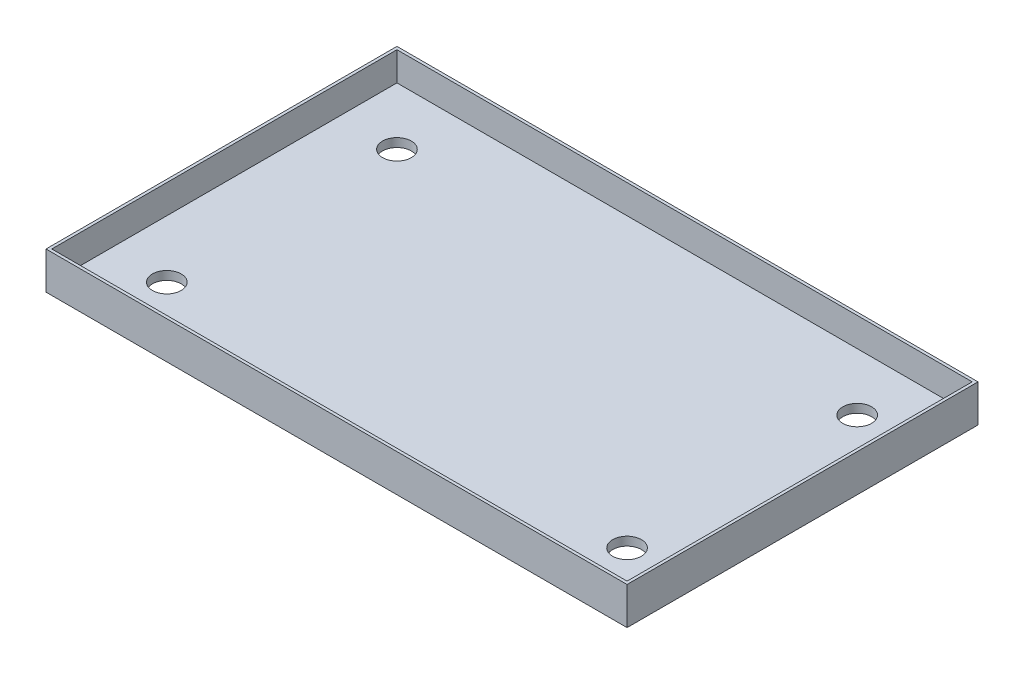
ISO-10303-21;
HEADER;
FILE_DESCRIPTION(('STEP AP214'),'2;1');
FILE_NAME('part.step','',(''),(''),'','','');
FILE_SCHEMA(('AUTOMOTIVE_DESIGN { 1 0 10303 214 1 1 1 1 }'));
ENDSEC;
DATA;
#1=APPLICATION_CONTEXT('core data for automotive mechanical design processes');
#2=APPLICATION_PROTOCOL_DEFINITION('international standard','automotive_design',2000,#1);
#3=PRODUCT_CONTEXT('',#1,'mechanical');
#4=PRODUCT('Part','Part','',(#3));
#5=PRODUCT_RELATED_PRODUCT_CATEGORY('part','',(#4));
#6=PRODUCT_DEFINITION_FORMATION('','',#4);
#7=PRODUCT_DEFINITION_CONTEXT('part definition',#1,'design');
#8=PRODUCT_DEFINITION('design','',#6,#7);
#9=PRODUCT_DEFINITION_SHAPE('','',#8);
#10=(LENGTH_UNIT() NAMED_UNIT(*) SI_UNIT(.MILLI.,.METRE.));
#11=(NAMED_UNIT(*) PLANE_ANGLE_UNIT() SI_UNIT($,.RADIAN.));
#12=(NAMED_UNIT(*) SI_UNIT($,.STERADIAN.) SOLID_ANGLE_UNIT());
#13=UNCERTAINTY_MEASURE_WITH_UNIT(LENGTH_MEASURE(1.E-05),#10,'distance_accuracy_value','');
#14=(GEOMETRIC_REPRESENTATION_CONTEXT(3) GLOBAL_UNCERTAINTY_ASSIGNED_CONTEXT((#13)) GLOBAL_UNIT_ASSIGNED_CONTEXT((#10,
#11,#12)) REPRESENTATION_CONTEXT('',''));
#15=CARTESIAN_POINT('',(0.,0.,0.));
#16=DIRECTION('',(0.,0.,1.));
#17=DIRECTION('',(1.,0.,0.));
#18=AXIS2_PLACEMENT_3D('',#15,#16,#17);
#19=CARTESIAN_POINT('',(0.,1.5,0.));
#20=DIRECTION('',(0.,1.,0.));
#21=DIRECTION('',(0.,0.,1.));
#22=AXIS2_PLACEMENT_3D('',#19,#20,#21);
#23=PLANE('',#22);
#24=CARTESIAN_POINT('',(80.,1.5,40.));
#25=DIRECTION('',(0.,1.,0.));
#26=DIRECTION('',(0.,0.,1.));
#27=AXIS2_PLACEMENT_3D('',#24,#25,#26);
#28=CIRCLE('',#27,5.00000000000001);
#29=CARTESIAN_POINT('',(80.,1.5,45.));
#30=VERTEX_POINT('',#29);
#31=EDGE_CURVE('E171',#30,#30,#28,.T.);
#32=ORIENTED_EDGE('',*,*,#31,.F.);
#33=EDGE_LOOP('',(#32));
#34=FACE_BOUND('',#33,.T.);
#35=CARTESIAN_POINT('',(-80.,1.5,-40.));
#36=DIRECTION('',(0.,1.,0.));
#37=DIRECTION('',(0.,0.,1.));
#38=AXIS2_PLACEMENT_3D('',#35,#36,#37);
#39=CIRCLE('',#38,5.00000000000001);
#40=CARTESIAN_POINT('',(-80.,1.5,-35.));
#41=VERTEX_POINT('',#40);
#42=EDGE_CURVE('E183',#41,#41,#39,.T.);
#43=ORIENTED_EDGE('',*,*,#42,.F.);
#44=EDGE_LOOP('',(#43));
#45=FACE_BOUND('',#44,.T.);
#46=DIRECTION('',(0.,0.,1.));
#47=VECTOR('',#46,1.);
#48=CARTESIAN_POINT('',(-100.,1.5,60.));
#49=LINE('',#48,#47);
#50=CARTESIAN_POINT('',(-100.,1.5,-60.));
#51=VERTEX_POINT('',#50);
#52=CARTESIAN_POINT('',(-100.,1.5,60.));
#53=VERTEX_POINT('',#52);
#54=EDGE_CURVE('E186',#51,#53,#49,.T.);
#55=ORIENTED_EDGE('',*,*,#54,.T.);
#56=DIRECTION('',(1.,0.,0.));
#57=VECTOR('',#56,1.);
#58=CARTESIAN_POINT('',(100.,1.5,60.));
#59=LINE('',#58,#57);
#60=CARTESIAN_POINT('',(100.,1.5,60.));
#61=VERTEX_POINT('',#60);
#62=EDGE_CURVE('E190',#53,#61,#59,.T.);
#63=ORIENTED_EDGE('',*,*,#62,.T.);
#64=DIRECTION('',(0.,0.,-1.));
#65=VECTOR('',#64,1.);
#66=CARTESIAN_POINT('',(100.,1.5,60.));
#67=LINE('',#66,#65);
#68=CARTESIAN_POINT('',(100.,1.5,-60.));
#69=VERTEX_POINT('',#68);
#70=EDGE_CURVE('E47',#61,#69,#67,.T.);
#71=ORIENTED_EDGE('',*,*,#70,.T.);
#72=DIRECTION('',(-1.,0.,0.));
#73=VECTOR('',#72,1.);
#74=CARTESIAN_POINT('',(100.,1.5,-60.));
#75=LINE('',#74,#73);
#76=EDGE_CURVE('E11',#69,#51,#75,.T.);
#77=ORIENTED_EDGE('',*,*,#76,.T.);
#78=EDGE_LOOP('',(#55,#63,#71,#77));
#79=FACE_BOUND('',#78,.T.);
#80=CARTESIAN_POINT('',(80.,1.5,-40.));
#81=DIRECTION('',(0.,1.,0.));
#82=DIRECTION('',(0.,0.,-1.));
#83=AXIS2_PLACEMENT_3D('',#80,#81,#82);
#84=CIRCLE('',#83,5.00000000000001);
#85=CARTESIAN_POINT('',(80.,1.5,-45.));
#86=VERTEX_POINT('',#85);
#87=EDGE_CURVE('E177',#86,#86,#84,.T.);
#88=ORIENTED_EDGE('',*,*,#87,.F.);
#89=EDGE_LOOP('',(#88));
#90=FACE_BOUND('',#89,.T.);
#91=CARTESIAN_POINT('',(-80.,1.5,40.));
#92=DIRECTION('',(0.,1.,0.));
#93=DIRECTION('',(0.,0.,-1.));
#94=AXIS2_PLACEMENT_3D('',#91,#92,#93);
#95=CIRCLE('',#94,5.00000000000001);
#96=CARTESIAN_POINT('',(-80.,1.5,35.));
#97=VERTEX_POINT('',#96);
#98=EDGE_CURVE('E165',#97,#97,#95,.T.);
#99=ORIENTED_EDGE('',*,*,#98,.F.);
#100=EDGE_LOOP('',(#99));
#101=FACE_BOUND('',#100,.T.);
#102=ADVANCED_FACE('F39',(#34,#45,#79,#90,#101),#23,.T.);
#103=CARTESIAN_POINT('',(0.,-1.5,0.));
#104=DIRECTION('',(0.,1.,0.));
#105=DIRECTION('',(0.,0.,1.));
#106=AXIS2_PLACEMENT_3D('',#103,#104,#105);
#107=PLANE('',#106);
#108=DIRECTION('',(0.,0.,1.));
#109=VECTOR('',#108,1.);
#110=CARTESIAN_POINT('',(101.,-1.5,-60.));
#111=LINE('',#110,#109);
#112=CARTESIAN_POINT('',(101.,-1.5,-61.));
#113=VERTEX_POINT('',#112);
#114=CARTESIAN_POINT('',(101.,-1.5,61.));
#115=VERTEX_POINT('',#114);
#116=EDGE_CURVE('E114',#113,#115,#111,.T.);
#117=ORIENTED_EDGE('',*,*,#116,.T.);
#118=DIRECTION('',(-1.,0.,0.));
#119=VECTOR('',#118,1.);
#120=CARTESIAN_POINT('',(101.,-1.5,61.));
#121=LINE('',#120,#119);
#122=CARTESIAN_POINT('',(-101.,-1.5,61.));
#123=VERTEX_POINT('',#122);
#124=EDGE_CURVE('E124',#115,#123,#121,.T.);
#125=ORIENTED_EDGE('',*,*,#124,.T.);
#126=DIRECTION('',(0.,0.,1.));
#127=VECTOR('',#126,1.);
#128=CARTESIAN_POINT('',(-101.,-1.5,-60.));
#129=LINE('',#128,#127);
#130=CARTESIAN_POINT('',(-101.,-1.5,-61.));
#131=VERTEX_POINT('',#130);
#132=EDGE_CURVE('E156',#131,#123,#129,.T.);
#133=ORIENTED_EDGE('',*,*,#132,.F.);
#134=DIRECTION('',(-1.,0.,0.));
#135=VECTOR('',#134,1.);
#136=CARTESIAN_POINT('',(101.,-1.5,-61.));
#137=LINE('',#136,#135);
#138=EDGE_CURVE('E138',#113,#131,#137,.T.);
#139=ORIENTED_EDGE('',*,*,#138,.F.);
#140=EDGE_LOOP('',(#117,#125,#133,#139));
#141=FACE_BOUND('',#140,.T.);
#142=CARTESIAN_POINT('',(-80.,-1.5,-40.));
#143=DIRECTION('',(0.,1.,0.));
#144=DIRECTION('',(0.,0.,1.));
#145=AXIS2_PLACEMENT_3D('',#142,#143,#144);
#146=CIRCLE('',#145,5.00000000000001);
#147=CARTESIAN_POINT('',(-80.,-1.5,-35.));
#148=VERTEX_POINT('',#147);
#149=EDGE_CURVE('E180',#148,#148,#146,.T.);
#150=ORIENTED_EDGE('',*,*,#149,.T.);
#151=EDGE_LOOP('',(#150));
#152=FACE_BOUND('',#151,.T.);
#153=CARTESIAN_POINT('',(80.,-1.5,-40.));
#154=DIRECTION('',(0.,1.,0.));
#155=DIRECTION('',(0.,0.,-1.));
#156=AXIS2_PLACEMENT_3D('',#153,#154,#155);
#157=CIRCLE('',#156,5.00000000000001);
#158=CARTESIAN_POINT('',(80.,-1.5,-45.));
#159=VERTEX_POINT('',#158);
#160=EDGE_CURVE('E174',#159,#159,#157,.T.);
#161=ORIENTED_EDGE('',*,*,#160,.T.);
#162=EDGE_LOOP('',(#161));
#163=FACE_BOUND('',#162,.T.);
#164=CARTESIAN_POINT('',(80.,-1.5,40.));
#165=DIRECTION('',(0.,1.,0.));
#166=DIRECTION('',(0.,0.,1.));
#167=AXIS2_PLACEMENT_3D('',#164,#165,#166);
#168=CIRCLE('',#167,5.00000000000001);
#169=CARTESIAN_POINT('',(80.,-1.5,45.));
#170=VERTEX_POINT('',#169);
#171=EDGE_CURVE('E168',#170,#170,#168,.T.);
#172=ORIENTED_EDGE('',*,*,#171,.T.);
#173=EDGE_LOOP('',(#172));
#174=FACE_BOUND('',#173,.T.);
#175=CARTESIAN_POINT('',(-80.,-1.5,40.));
#176=DIRECTION('',(0.,1.,0.));
#177=DIRECTION('',(0.,0.,-1.));
#178=AXIS2_PLACEMENT_3D('',#175,#176,#177);
#179=CIRCLE('',#178,5.00000000000001);
#180=CARTESIAN_POINT('',(-80.,-1.5,35.));
#181=VERTEX_POINT('',#180);
#182=EDGE_CURVE('E160',#181,#181,#179,.T.);
#183=ORIENTED_EDGE('',*,*,#182,.T.);
#184=EDGE_LOOP('',(#183));
#185=FACE_BOUND('',#184,.T.);
#186=ADVANCED_FACE('F41',(#141,#152,#163,#174,#185),#107,.F.);
#187=CARTESIAN_POINT('',(-80.,1.5,-40.));
#188=DIRECTION('',(0.,-1.,0.));
#189=DIRECTION('',(0.,0.,-1.));
#190=AXIS2_PLACEMENT_3D('',#187,#188,#189);
#191=CYLINDRICAL_SURFACE('',#190,5.00000000000001);
#192=ORIENTED_EDGE('',*,*,#42,.T.);
#193=EDGE_LOOP('',(#192));
#194=FACE_BOUND('',#193,.T.);
#195=ORIENTED_EDGE('',*,*,#149,.F.);
#196=EDGE_LOOP('',(#195));
#197=FACE_BOUND('',#196,.T.);
#198=ADVANCED_FACE('F222',(#194,#197),#191,.F.);
#199=CARTESIAN_POINT('',(80.,1.5,-40.));
#200=DIRECTION('',(0.,-1.,0.));
#201=DIRECTION('',(0.,0.,-1.));
#202=AXIS2_PLACEMENT_3D('',#199,#200,#201);
#203=CYLINDRICAL_SURFACE('',#202,5.00000000000001);
#204=ORIENTED_EDGE('',*,*,#87,.T.);
#205=EDGE_LOOP('',(#204));
#206=FACE_BOUND('',#205,.T.);
#207=ORIENTED_EDGE('',*,*,#160,.F.);
#208=EDGE_LOOP('',(#207));
#209=FACE_BOUND('',#208,.T.);
#210=ADVANCED_FACE('F229',(#206,#209),#203,.F.);
#211=CARTESIAN_POINT('',(80.,1.5,40.));
#212=DIRECTION('',(0.,-1.,0.));
#213=DIRECTION('',(0.,0.,-1.));
#214=AXIS2_PLACEMENT_3D('',#211,#212,#213);
#215=CYLINDRICAL_SURFACE('',#214,5.00000000000001);
#216=ORIENTED_EDGE('',*,*,#31,.T.);
#217=EDGE_LOOP('',(#216));
#218=FACE_BOUND('',#217,.T.);
#219=ORIENTED_EDGE('',*,*,#171,.F.);
#220=EDGE_LOOP('',(#219));
#221=FACE_BOUND('',#220,.T.);
#222=ADVANCED_FACE('F233',(#218,#221),#215,.F.);
#223=CARTESIAN_POINT('',(-80.,1.5,40.));
#224=DIRECTION('',(0.,-1.,0.));
#225=DIRECTION('',(0.,0.,-1.));
#226=AXIS2_PLACEMENT_3D('',#223,#224,#225);
#227=CYLINDRICAL_SURFACE('',#226,5.00000000000001);
#228=ORIENTED_EDGE('',*,*,#98,.T.);
#229=EDGE_LOOP('',(#228));
#230=FACE_BOUND('',#229,.T.);
#231=ORIENTED_EDGE('',*,*,#182,.F.);
#232=EDGE_LOOP('',(#231));
#233=FACE_BOUND('',#232,.T.);
#234=ADVANCED_FACE('F237',(#230,#233),#227,.F.);
#235=CARTESIAN_POINT('',(-100.,0.,0.));
#236=DIRECTION('',(1.,0.,0.));
#237=DIRECTION('',(0.,0.,-1.));
#238=AXIS2_PLACEMENT_3D('',#235,#236,#237);
#239=PLANE('',#238);
#240=ORIENTED_EDGE('',*,*,#54,.F.);
#241=DIRECTION('',(0.,-1.,0.));
#242=VECTOR('',#241,1.);
#243=CARTESIAN_POINT('',(-100.,-1.5,-60.));
#244=LINE('',#243,#242);
#245=CARTESIAN_POINT('',(-100.,11.5,-60.));
#246=VERTEX_POINT('',#245);
#247=EDGE_CURVE('E150',#246,#51,#244,.T.);
#248=ORIENTED_EDGE('',*,*,#247,.F.);
#249=DIRECTION('',(0.,0.,-1.));
#250=VECTOR('',#249,1.);
#251=CARTESIAN_POINT('',(-100.,11.5,-60.));
#252=LINE('',#251,#250);
#253=CARTESIAN_POINT('',(-100.,11.5,60.));
#254=VERTEX_POINT('',#253);
#255=EDGE_CURVE('E158',#254,#246,#252,.T.);
#256=ORIENTED_EDGE('',*,*,#255,.F.);
#257=DIRECTION('',(0.,1.,0.));
#258=VECTOR('',#257,1.);
#259=CARTESIAN_POINT('',(-100.,-1.5,60.));
#260=LINE('',#259,#258);
#261=EDGE_CURVE('E60',#53,#254,#260,.T.);
#262=ORIENTED_EDGE('',*,*,#261,.F.);
#263=EDGE_LOOP('',(#240,#248,#256,#262));
#264=FACE_BOUND('',#263,.T.);
#265=ADVANCED_FACE('F204',(#264),#239,.T.);
#266=CARTESIAN_POINT('',(-101.,11.5,-60.));
#267=DIRECTION('',(0.,-1.,0.));
#268=DIRECTION('',(0.,0.,-1.));
#269=AXIS2_PLACEMENT_3D('',#266,#267,#268);
#270=PLANE('',#269);
#271=DIRECTION('',(0.,0.,-1.));
#272=VECTOR('',#271,1.);
#273=CARTESIAN_POINT('',(100.,11.5,-60.));
#274=LINE('',#273,#272);
#275=CARTESIAN_POINT('',(100.,11.5,60.));
#276=VERTEX_POINT('',#275);
#277=CARTESIAN_POINT('',(100.,11.5,-60.));
#278=VERTEX_POINT('',#277);
#279=EDGE_CURVE('E152',#276,#278,#274,.T.);
#280=ORIENTED_EDGE('',*,*,#279,.F.);
#281=DIRECTION('',(1.,0.,0.));
#282=VECTOR('',#281,1.);
#283=CARTESIAN_POINT('',(101.,11.5,60.));
#284=LINE('',#283,#282);
#285=EDGE_CURVE('E125',#254,#276,#284,.T.);
#286=ORIENTED_EDGE('',*,*,#285,.F.);
#287=ORIENTED_EDGE('',*,*,#255,.T.);
#288=DIRECTION('',(1.,0.,0.));
#289=VECTOR('',#288,1.);
#290=CARTESIAN_POINT('',(101.,11.5,-60.));
#291=LINE('',#290,#289);
#292=EDGE_CURVE('E134',#246,#278,#291,.T.);
#293=ORIENTED_EDGE('',*,*,#292,.T.);
#294=EDGE_LOOP('',(#280,#286,#287,#293));
#295=FACE_BOUND('',#294,.T.);
#296=DIRECTION('',(1.,0.,0.));
#297=VECTOR('',#296,1.);
#298=CARTESIAN_POINT('',(101.,11.5,61.));
#299=LINE('',#298,#297);
#300=CARTESIAN_POINT('',(-101.,11.5,61.));
#301=VERTEX_POINT('',#300);
#302=CARTESIAN_POINT('',(101.,11.5,61.));
#303=VERTEX_POINT('',#302);
#304=EDGE_CURVE('E121',#301,#303,#299,.T.);
#305=ORIENTED_EDGE('',*,*,#304,.T.);
#306=DIRECTION('',(0.,0.,-1.));
#307=VECTOR('',#306,1.);
#308=CARTESIAN_POINT('',(101.,11.5,-60.));
#309=LINE('',#308,#307);
#310=CARTESIAN_POINT('',(101.,11.5,-61.));
#311=VERTEX_POINT('',#310);
#312=EDGE_CURVE('E103',#303,#311,#309,.T.);
#313=ORIENTED_EDGE('',*,*,#312,.T.);
#314=DIRECTION('',(1.,0.,0.));
#315=VECTOR('',#314,1.);
#316=CARTESIAN_POINT('',(101.,11.5,-61.));
#317=LINE('',#316,#315);
#318=CARTESIAN_POINT('',(-101.,11.5,-61.));
#319=VERTEX_POINT('',#318);
#320=EDGE_CURVE('E144',#319,#311,#317,.T.);
#321=ORIENTED_EDGE('',*,*,#320,.F.);
#322=DIRECTION('',(0.,0.,-1.));
#323=VECTOR('',#322,1.);
#324=CARTESIAN_POINT('',(-101.,11.5,-60.));
#325=LINE('',#324,#323);
#326=EDGE_CURVE('E128',#301,#319,#325,.T.);
#327=ORIENTED_EDGE('',*,*,#326,.F.);
#328=EDGE_LOOP('',(#305,#313,#321,#327));
#329=FACE_BOUND('',#328,.T.);
#330=ADVANCED_FACE('F127',(#295,#329),#270,.F.);
#331=CARTESIAN_POINT('',(-101.,0.,0.));
#332=DIRECTION('',(1.,0.,0.));
#333=DIRECTION('',(0.,0.,-1.));
#334=AXIS2_PLACEMENT_3D('',#331,#332,#333);
#335=PLANE('',#334);
#336=ORIENTED_EDGE('',*,*,#326,.T.);
#337=DIRECTION('',(0.,1.,0.));
#338=VECTOR('',#337,1.);
#339=CARTESIAN_POINT('',(-101.,-1.5,-61.));
#340=LINE('',#339,#338);
#341=EDGE_CURVE('E141',#131,#319,#340,.T.);
#342=ORIENTED_EDGE('',*,*,#341,.F.);
#343=ORIENTED_EDGE('',*,*,#132,.T.);
#344=DIRECTION('',(0.,1.,0.));
#345=VECTOR('',#344,1.);
#346=CARTESIAN_POINT('',(-101.,-1.5,61.));
#347=LINE('',#346,#345);
#348=EDGE_CURVE('E129',#123,#301,#347,.T.);
#349=ORIENTED_EDGE('',*,*,#348,.T.);
#350=EDGE_LOOP('',(#336,#342,#343,#349));
#351=FACE_BOUND('',#350,.T.);
#352=ADVANCED_FACE('F244',(#351),#335,.F.);
#353=CARTESIAN_POINT('',(100.,0.,0.));
#354=DIRECTION('',(-1.,0.,0.));
#355=DIRECTION('',(0.,0.,-1.));
#356=AXIS2_PLACEMENT_3D('',#353,#354,#355);
#357=PLANE('',#356);
#358=ORIENTED_EDGE('',*,*,#70,.F.);
#359=DIRECTION('',(0.,1.,0.));
#360=VECTOR('',#359,1.);
#361=CARTESIAN_POINT('',(100.,-1.5,60.));
#362=LINE('',#361,#360);
#363=EDGE_CURVE('E115',#61,#276,#362,.T.);
#364=ORIENTED_EDGE('',*,*,#363,.T.);
#365=ORIENTED_EDGE('',*,*,#279,.T.);
#366=DIRECTION('',(0.,-1.,0.));
#367=VECTOR('',#366,1.);
#368=CARTESIAN_POINT('',(100.,-1.5,-60.));
#369=LINE('',#368,#367);
#370=EDGE_CURVE('E146',#278,#69,#369,.T.);
#371=ORIENTED_EDGE('',*,*,#370,.T.);
#372=EDGE_LOOP('',(#358,#364,#365,#371));
#373=FACE_BOUND('',#372,.T.);
#374=ADVANCED_FACE('F198',(#373),#357,.T.);
#375=CARTESIAN_POINT('',(101.,0.,0.));
#376=DIRECTION('',(-1.,0.,0.));
#377=DIRECTION('',(0.,0.,-1.));
#378=AXIS2_PLACEMENT_3D('',#375,#376,#377);
#379=PLANE('',#378);
#380=ORIENTED_EDGE('',*,*,#116,.F.);
#381=DIRECTION('',(0.,-1.,0.));
#382=VECTOR('',#381,1.);
#383=CARTESIAN_POINT('',(101.,-1.5,-61.));
#384=LINE('',#383,#382);
#385=EDGE_CURVE('E109',#311,#113,#384,.T.);
#386=ORIENTED_EDGE('',*,*,#385,.F.);
#387=ORIENTED_EDGE('',*,*,#312,.F.);
#388=DIRECTION('',(0.,-1.,0.));
#389=VECTOR('',#388,1.);
#390=CARTESIAN_POINT('',(101.,-1.5,61.));
#391=LINE('',#390,#389);
#392=EDGE_CURVE('E106',#303,#115,#391,.T.);
#393=ORIENTED_EDGE('',*,*,#392,.T.);
#394=EDGE_LOOP('',(#380,#386,#387,#393));
#395=FACE_BOUND('',#394,.T.);
#396=ADVANCED_FACE('F105',(#395),#379,.F.);
#397=CARTESIAN_POINT('',(0.,0.,-61.));
#398=DIRECTION('',(0.,0.,1.));
#399=DIRECTION('',(1.,0.,0.));
#400=AXIS2_PLACEMENT_3D('',#397,#398,#399);
#401=PLANE('',#400);
#402=ORIENTED_EDGE('',*,*,#385,.T.);
#403=ORIENTED_EDGE('',*,*,#138,.T.);
#404=ORIENTED_EDGE('',*,*,#341,.T.);
#405=ORIENTED_EDGE('',*,*,#320,.T.);
#406=EDGE_LOOP('',(#402,#403,#404,#405));
#407=FACE_BOUND('',#406,.T.);
#408=ADVANCED_FACE('F214',(#407),#401,.F.);
#409=CARTESIAN_POINT('',(0.,0.,-60.));
#410=DIRECTION('',(0.,0.,1.));
#411=DIRECTION('',(1.,0.,0.));
#412=AXIS2_PLACEMENT_3D('',#409,#410,#411);
#413=PLANE('',#412);
#414=ORIENTED_EDGE('',*,*,#292,.F.);
#415=ORIENTED_EDGE('',*,*,#247,.T.);
#416=ORIENTED_EDGE('',*,*,#76,.F.);
#417=ORIENTED_EDGE('',*,*,#370,.F.);
#418=EDGE_LOOP('',(#414,#415,#416,#417));
#419=FACE_BOUND('',#418,.T.);
#420=ADVANCED_FACE('F200',(#419),#413,.T.);
#421=CARTESIAN_POINT('',(0.,0.,60.));
#422=DIRECTION('',(0.,0.,-1.));
#423=DIRECTION('',(1.,0.,0.));
#424=AXIS2_PLACEMENT_3D('',#421,#422,#423);
#425=PLANE('',#424);
#426=ORIENTED_EDGE('',*,*,#363,.F.);
#427=ORIENTED_EDGE('',*,*,#62,.F.);
#428=ORIENTED_EDGE('',*,*,#261,.T.);
#429=ORIENTED_EDGE('',*,*,#285,.T.);
#430=EDGE_LOOP('',(#426,#427,#428,#429));
#431=FACE_BOUND('',#430,.T.);
#432=ADVANCED_FACE('F206',(#431),#425,.T.);
#433=CARTESIAN_POINT('',(0.,0.,61.));
#434=DIRECTION('',(0.,0.,-1.));
#435=DIRECTION('',(1.,0.,0.));
#436=AXIS2_PLACEMENT_3D('',#433,#434,#435);
#437=PLANE('',#436);
#438=ORIENTED_EDGE('',*,*,#392,.F.);
#439=ORIENTED_EDGE('',*,*,#304,.F.);
#440=ORIENTED_EDGE('',*,*,#348,.F.);
#441=ORIENTED_EDGE('',*,*,#124,.F.);
#442=EDGE_LOOP('',(#438,#439,#440,#441));
#443=FACE_BOUND('',#442,.T.);
#444=ADVANCED_FACE('F119',(#443),#437,.F.);
#445=CLOSED_SHELL('',(#102,#186,#198,#210,#222,#234,#265,#330,#352,#374,#396,#408,#420,#432,#444));
#446=MANIFOLD_SOLID_BREP('B2',#445);
#447=ADVANCED_BREP_SHAPE_REPRESENTATION('',(#18,#446),#14);
#448=SHAPE_DEFINITION_REPRESENTATION(#9,#447);
ENDSEC;
END-ISO-10303-21;
